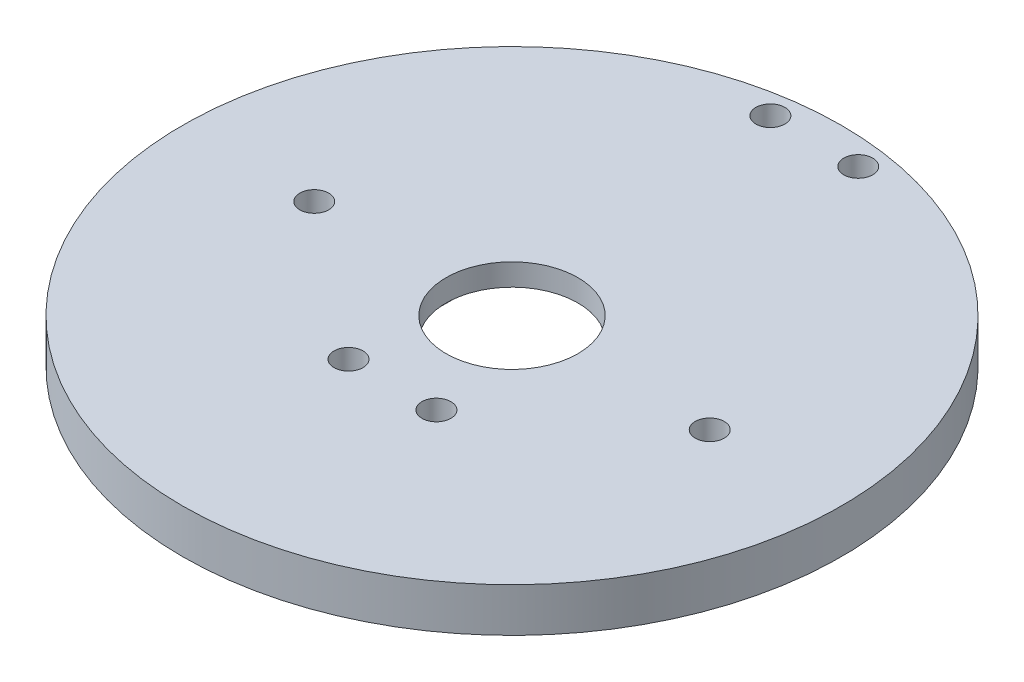
ISO-10303-21;
HEADER;
FILE_DESCRIPTION(('STEP AP214'),'2;1');
FILE_NAME('part.step','',(''),(''),'','','');
FILE_SCHEMA(('AUTOMOTIVE_DESIGN { 1 0 10303 214 1 1 1 1 }'));
ENDSEC;
DATA;
#1=APPLICATION_CONTEXT('core data for automotive mechanical design processes');
#2=APPLICATION_PROTOCOL_DEFINITION('international standard','automotive_design',2000,#1);
#3=PRODUCT_CONTEXT('',#1,'mechanical');
#4=PRODUCT('Part','Part','',(#3));
#5=PRODUCT_RELATED_PRODUCT_CATEGORY('part','',(#4));
#6=PRODUCT_DEFINITION_FORMATION('','',#4);
#7=PRODUCT_DEFINITION_CONTEXT('part definition',#1,'design');
#8=PRODUCT_DEFINITION('design','',#6,#7);
#9=PRODUCT_DEFINITION_SHAPE('','',#8);
#10=(LENGTH_UNIT() NAMED_UNIT(*) SI_UNIT(.MILLI.,.METRE.));
#11=(NAMED_UNIT(*) PLANE_ANGLE_UNIT() SI_UNIT($,.RADIAN.));
#12=(NAMED_UNIT(*) SI_UNIT($,.STERADIAN.) SOLID_ANGLE_UNIT());
#13=UNCERTAINTY_MEASURE_WITH_UNIT(LENGTH_MEASURE(1.E-05),#10,'distance_accuracy_value','');
#14=(GEOMETRIC_REPRESENTATION_CONTEXT(3) GLOBAL_UNCERTAINTY_ASSIGNED_CONTEXT((#13)) GLOBAL_UNIT_ASSIGNED_CONTEXT((#10,
#11,#12)) REPRESENTATION_CONTEXT('',''));
#15=CARTESIAN_POINT('',(0.,0.,0.));
#16=DIRECTION('',(0.,0.,1.));
#17=DIRECTION('',(1.,0.,0.));
#18=AXIS2_PLACEMENT_3D('',#15,#16,#17);
#19=CARTESIAN_POINT('',(0.,-5.,0.));
#20=DIRECTION('',(0.,1.,0.));
#21=DIRECTION('',(0.,0.,1.));
#22=AXIS2_PLACEMENT_3D('',#19,#20,#21);
#23=CYLINDRICAL_SURFACE('',#22,37.5);
#24=CARTESIAN_POINT('',(0.,-5.,0.));
#25=DIRECTION('',(0.,1.,0.));
#26=DIRECTION('',(0.,0.,1.));
#27=AXIS2_PLACEMENT_3D('',#24,#25,#26);
#28=CIRCLE('',#27,37.5);
#29=CARTESIAN_POINT('',(0.,-5.,37.5));
#30=VERTEX_POINT('',#29);
#31=EDGE_CURVE('E11',#30,#30,#28,.T.);
#32=ORIENTED_EDGE('',*,*,#31,.T.);
#33=EDGE_LOOP('',(#32));
#34=FACE_BOUND('',#33,.T.);
#35=CARTESIAN_POINT('',(0.,0.,0.));
#36=DIRECTION('',(0.,1.,0.));
#37=DIRECTION('',(0.,0.,1.));
#38=AXIS2_PLACEMENT_3D('',#35,#36,#37);
#39=CIRCLE('',#38,37.5);
#40=CARTESIAN_POINT('',(0.,0.,37.5));
#41=VERTEX_POINT('',#40);
#42=EDGE_CURVE('E33',#41,#41,#39,.T.);
#43=ORIENTED_EDGE('',*,*,#42,.F.);
#44=EDGE_LOOP('',(#43));
#45=FACE_BOUND('',#44,.T.);
#46=ADVANCED_FACE('F30',(#34,#45),#23,.T.);
#47=CARTESIAN_POINT('',(0.,-5.,0.));
#48=DIRECTION('',(0.,1.,0.));
#49=DIRECTION('',(0.,0.,1.));
#50=AXIS2_PLACEMENT_3D('',#47,#48,#49);
#51=PLANE('',#50);
#52=CARTESIAN_POINT('',(-4.99999999999991,-5.,-34.4));
#53=DIRECTION('',(0.,-1.,0.));
#54=DIRECTION('',(0.,0.,-1.));
#55=AXIS2_PLACEMENT_3D('',#52,#53,#54);
#56=CIRCLE('',#55,1.64999999999999);
#57=CARTESIAN_POINT('',(-4.99999999999991,-5.,-36.05));
#58=VERTEX_POINT('',#57);
#59=EDGE_CURVE('E367',#58,#58,#56,.T.);
#60=ORIENTED_EDGE('',*,*,#59,.F.);
#61=EDGE_LOOP('',(#60));
#62=FACE_BOUND('',#61,.T.);
#63=CARTESIAN_POINT('',(5.00000000000012,-5.,-34.4));
#64=DIRECTION('',(0.,-1.,0.));
#65=DIRECTION('',(0.,0.,-1.));
#66=AXIS2_PLACEMENT_3D('',#63,#64,#65);
#67=CIRCLE('',#66,1.64999999999999);
#68=CARTESIAN_POINT('',(5.00000000000012,-5.,-36.05));
#69=VERTEX_POINT('',#68);
#70=EDGE_CURVE('E369',#69,#69,#67,.T.);
#71=ORIENTED_EDGE('',*,*,#70,.F.);
#72=EDGE_LOOP('',(#71));
#73=FACE_BOUND('',#72,.T.);
#74=CARTESIAN_POINT('',(-5.00000000000005,-5.,13.6));
#75=DIRECTION('',(0.,-1.,0.));
#76=DIRECTION('',(0.,0.,-1.));
#77=AXIS2_PLACEMENT_3D('',#74,#75,#76);
#78=CIRCLE('',#77,1.64999999999999);
#79=CARTESIAN_POINT('',(-5.00000000000005,-5.,11.95));
#80=VERTEX_POINT('',#79);
#81=EDGE_CURVE('E377',#80,#80,#78,.T.);
#82=ORIENTED_EDGE('',*,*,#81,.F.);
#83=EDGE_LOOP('',(#82));
#84=FACE_BOUND('',#83,.T.);
#85=CARTESIAN_POINT('',(4.99999999999996,-5.,13.6));
#86=DIRECTION('',(0.,-1.,0.));
#87=DIRECTION('',(0.,0.,-1.));
#88=AXIS2_PLACEMENT_3D('',#85,#86,#87);
#89=CIRCLE('',#88,1.64999999999999);
#90=CARTESIAN_POINT('',(4.99999999999996,-5.,11.95));
#91=VERTEX_POINT('',#90);
#92=EDGE_CURVE('E383',#91,#91,#89,.T.);
#93=ORIENTED_EDGE('',*,*,#92,.F.);
#94=EDGE_LOOP('',(#93));
#95=FACE_BOUND('',#94,.T.);
#96=CARTESIAN_POINT('',(22.5,-5.,0.));
#97=DIRECTION('',(0.,-1.,0.));
#98=DIRECTION('',(0.,0.,-1.));
#99=AXIS2_PLACEMENT_3D('',#96,#97,#98);
#100=CIRCLE('',#99,1.64999999999999);
#101=CARTESIAN_POINT('',(22.5,-5.,-1.64999999999999));
#102=VERTEX_POINT('',#101);
#103=EDGE_CURVE('E389',#102,#102,#100,.T.);
#104=ORIENTED_EDGE('',*,*,#103,.F.);
#105=EDGE_LOOP('',(#104));
#106=FACE_BOUND('',#105,.T.);
#107=CARTESIAN_POINT('',(-22.5,-5.,0.));
#108=DIRECTION('',(0.,-1.,0.));
#109=DIRECTION('',(0.,0.,-1.));
#110=AXIS2_PLACEMENT_3D('',#107,#108,#109);
#111=CIRCLE('',#110,1.64999999999999);
#112=CARTESIAN_POINT('',(-22.5,-5.,-1.64999999999999));
#113=VERTEX_POINT('',#112);
#114=EDGE_CURVE('E395',#113,#113,#111,.T.);
#115=ORIENTED_EDGE('',*,*,#114,.F.);
#116=EDGE_LOOP('',(#115));
#117=FACE_BOUND('',#116,.T.);
#118=DIRECTION('',(0.,0.,1.));
#119=VECTOR('',#118,1.);
#120=CARTESIAN_POINT('',(9.94999999999997,-5.,0.999999999999964));
#121=LINE('',#120,#119);
#122=CARTESIAN_POINT('',(9.94999999999997,-5.,-21.8));
#123=VERTEX_POINT('',#122);
#124=CARTESIAN_POINT('',(9.94999999999997,-5.,0.999999999999964));
#125=VERTEX_POINT('',#124);
#126=EDGE_CURVE('E130',#123,#125,#121,.T.);
#127=ORIENTED_EDGE('',*,*,#126,.F.);
#128=CARTESIAN_POINT('',(0.949999999999968,-5.,-21.8));
#129=DIRECTION('',(0.,-1.,0.));
#130=DIRECTION('',(0.,0.,-1.));
#131=AXIS2_PLACEMENT_3D('',#128,#129,#130);
#132=CIRCLE('',#131,9.);
#133=CARTESIAN_POINT('',(0.94999999999997,-5.,-30.8));
#134=VERTEX_POINT('',#133);
#135=EDGE_CURVE('E44',#134,#123,#132,.T.);
#136=ORIENTED_EDGE('',*,*,#135,.F.);
#137=DIRECTION('',(1.,0.,0.));
#138=VECTOR('',#137,1.);
#139=CARTESIAN_POINT('',(-0.949999999999907,-5.,-30.8));
#140=LINE('',#139,#138);
#141=CARTESIAN_POINT('',(-0.949999999999907,-5.,-30.8));
#142=VERTEX_POINT('',#141);
#143=EDGE_CURVE('E146',#142,#134,#140,.T.);
#144=ORIENTED_EDGE('',*,*,#143,.F.);
#145=CARTESIAN_POINT('',(-0.949999999999909,-5.,-21.8));
#146=DIRECTION('',(0.,-1.,0.));
#147=DIRECTION('',(0.,0.,-1.));
#148=AXIS2_PLACEMENT_3D('',#145,#146,#147);
#149=CIRCLE('',#148,9.);
#150=CARTESIAN_POINT('',(-9.94999999999991,-5.,-21.8));
#151=VERTEX_POINT('',#150);
#152=EDGE_CURVE('E144',#151,#142,#149,.T.);
#153=ORIENTED_EDGE('',*,*,#152,.F.);
#154=DIRECTION('',(0.,0.,-1.));
#155=VECTOR('',#154,1.);
#156=CARTESIAN_POINT('',(-9.94999999999991,-5.,0.999999999999964));
#157=LINE('',#156,#155);
#158=CARTESIAN_POINT('',(-9.94999999999991,-5.,0.999999999999964));
#159=VERTEX_POINT('',#158);
#160=EDGE_CURVE('E104',#159,#151,#157,.T.);
#161=ORIENTED_EDGE('',*,*,#160,.F.);
#162=CARTESIAN_POINT('',(-0.949999999999913,-5.,0.999999999999964));
#163=DIRECTION('',(0.,-1.,0.));
#164=DIRECTION('',(0.,0.,-1.));
#165=AXIS2_PLACEMENT_3D('',#162,#163,#164);
#166=CIRCLE('',#165,9.);
#167=CARTESIAN_POINT('',(-0.949999999999912,-5.,9.99999999999996));
#168=VERTEX_POINT('',#167);
#169=EDGE_CURVE('E140',#168,#159,#166,.T.);
#170=ORIENTED_EDGE('',*,*,#169,.F.);
#171=DIRECTION('',(-1.,0.,0.));
#172=VECTOR('',#171,1.);
#173=CARTESIAN_POINT('',(-0.949999999999913,-5.,9.99999999999996));
#174=LINE('',#173,#172);
#175=CARTESIAN_POINT('',(0.949999999999968,-5.,9.99999999999996));
#176=VERTEX_POINT('',#175);
#177=EDGE_CURVE('E137',#176,#168,#174,.T.);
#178=ORIENTED_EDGE('',*,*,#177,.F.);
#179=CARTESIAN_POINT('',(0.949999999999968,-5.,0.999999999999964));
#180=DIRECTION('',(0.,-1.,0.));
#181=DIRECTION('',(0.,0.,-1.));
#182=AXIS2_PLACEMENT_3D('',#179,#180,#181);
#183=CIRCLE('',#182,9.);
#184=EDGE_CURVE('E134',#125,#176,#183,.T.);
#185=ORIENTED_EDGE('',*,*,#184,.F.);
#186=EDGE_LOOP('',(#127,#136,#144,#153,#161,#170,#178,#185));
#187=FACE_BOUND('',#186,.T.);
#188=ORIENTED_EDGE('',*,*,#31,.F.);
#189=EDGE_LOOP('',(#188));
#190=FACE_BOUND('',#189,.T.);
#191=ADVANCED_FACE('F165',(#62,#73,#84,#95,#106,#117,#187,#190),#51,.F.);
#192=CARTESIAN_POINT('',(0.,0.,0.));
#193=DIRECTION('',(0.,1.,0.));
#194=DIRECTION('',(0.,0.,1.));
#195=AXIS2_PLACEMENT_3D('',#192,#193,#194);
#196=PLANE('',#195);
#197=CARTESIAN_POINT('',(-4.99999999999991,0.,-34.4));
#198=DIRECTION('',(0.,-1.,0.));
#199=DIRECTION('',(0.,0.,-1.));
#200=AXIS2_PLACEMENT_3D('',#197,#198,#199);
#201=CIRCLE('',#200,1.65);
#202=CARTESIAN_POINT('',(-4.99999999999991,0.,-36.05));
#203=VERTEX_POINT('',#202);
#204=EDGE_CURVE('E364',#203,#203,#201,.T.);
#205=ORIENTED_EDGE('',*,*,#204,.T.);
#206=EDGE_LOOP('',(#205));
#207=FACE_BOUND('',#206,.T.);
#208=CARTESIAN_POINT('',(5.00000000000012,0.,-34.4));
#209=DIRECTION('',(0.,-1.,0.));
#210=DIRECTION('',(0.,0.,-1.));
#211=AXIS2_PLACEMENT_3D('',#208,#209,#210);
#212=CIRCLE('',#211,1.65);
#213=CARTESIAN_POINT('',(5.00000000000012,0.,-36.05));
#214=VERTEX_POINT('',#213);
#215=EDGE_CURVE('E374',#214,#214,#212,.T.);
#216=ORIENTED_EDGE('',*,*,#215,.T.);
#217=EDGE_LOOP('',(#216));
#218=FACE_BOUND('',#217,.T.);
#219=CARTESIAN_POINT('',(-5.00000000000005,0.,13.6));
#220=DIRECTION('',(0.,-1.,0.));
#221=DIRECTION('',(0.,0.,-1.));
#222=AXIS2_PLACEMENT_3D('',#219,#220,#221);
#223=CIRCLE('',#222,1.65);
#224=CARTESIAN_POINT('',(-5.00000000000005,0.,11.95));
#225=VERTEX_POINT('',#224);
#226=EDGE_CURVE('E380',#225,#225,#223,.T.);
#227=ORIENTED_EDGE('',*,*,#226,.T.);
#228=EDGE_LOOP('',(#227));
#229=FACE_BOUND('',#228,.T.);
#230=CARTESIAN_POINT('',(4.99999999999996,0.,13.6));
#231=DIRECTION('',(0.,-1.,0.));
#232=DIRECTION('',(0.,0.,-1.));
#233=AXIS2_PLACEMENT_3D('',#230,#231,#232);
#234=CIRCLE('',#233,1.65);
#235=CARTESIAN_POINT('',(4.99999999999996,0.,11.95));
#236=VERTEX_POINT('',#235);
#237=EDGE_CURVE('E386',#236,#236,#234,.T.);
#238=ORIENTED_EDGE('',*,*,#237,.T.);
#239=EDGE_LOOP('',(#238));
#240=FACE_BOUND('',#239,.T.);
#241=CARTESIAN_POINT('',(22.5,0.,0.));
#242=DIRECTION('',(0.,-1.,0.));
#243=DIRECTION('',(0.,0.,-1.));
#244=AXIS2_PLACEMENT_3D('',#241,#242,#243);
#245=CIRCLE('',#244,1.65);
#246=CARTESIAN_POINT('',(22.5,0.,-1.65));
#247=VERTEX_POINT('',#246);
#248=EDGE_CURVE('E392',#247,#247,#245,.T.);
#249=ORIENTED_EDGE('',*,*,#248,.T.);
#250=EDGE_LOOP('',(#249));
#251=FACE_BOUND('',#250,.T.);
#252=CARTESIAN_POINT('',(-22.5,0.,0.));
#253=DIRECTION('',(0.,-1.,0.));
#254=DIRECTION('',(0.,0.,-1.));
#255=AXIS2_PLACEMENT_3D('',#252,#253,#254);
#256=CIRCLE('',#255,1.65);
#257=CARTESIAN_POINT('',(-22.5,0.,-1.65));
#258=VERTEX_POINT('',#257);
#259=EDGE_CURVE('E398',#258,#258,#256,.T.);
#260=ORIENTED_EDGE('',*,*,#259,.T.);
#261=EDGE_LOOP('',(#260));
#262=FACE_BOUND('',#261,.T.);
#263=CARTESIAN_POINT('',(0.,0.,0.));
#264=DIRECTION('',(0.,-1.,0.));
#265=DIRECTION('',(1.,0.,0.));
#266=AXIS2_PLACEMENT_3D('',#263,#264,#265);
#267=CIRCLE('',#266,7.50000000000001);
#268=CARTESIAN_POINT('',(7.50000000000001,0.,0.));
#269=VERTEX_POINT('',#268);
#270=EDGE_CURVE('E131',#269,#269,#267,.T.);
#271=ORIENTED_EDGE('',*,*,#270,.T.);
#272=EDGE_LOOP('',(#271));
#273=FACE_BOUND('',#272,.T.);
#274=ORIENTED_EDGE('',*,*,#42,.T.);
#275=EDGE_LOOP('',(#274));
#276=FACE_BOUND('',#275,.T.);
#277=ADVANCED_FACE('F193',(#207,#218,#229,#240,#251,#262,#273,#276),#196,.T.);
#278=CARTESIAN_POINT('',(0.949999999999968,-2.5,-21.8));
#279=DIRECTION('',(0.,-1.,0.));
#280=DIRECTION('',(0.,0.,-1.));
#281=AXIS2_PLACEMENT_3D('',#278,#279,#280);
#282=CYLINDRICAL_SURFACE('',#281,9.);
#283=ORIENTED_EDGE('',*,*,#135,.T.);
#284=DIRECTION('',(0.,-1.,0.));
#285=VECTOR('',#284,1.);
#286=CARTESIAN_POINT('',(9.94999999999997,-2.5,-21.8));
#287=LINE('',#286,#285);
#288=CARTESIAN_POINT('',(9.94999999999997,-2.5,-21.8));
#289=VERTEX_POINT('',#288);
#290=EDGE_CURVE('E80',#289,#123,#287,.T.);
#291=ORIENTED_EDGE('',*,*,#290,.F.);
#292=CARTESIAN_POINT('',(0.949999999999968,-2.5,-21.8));
#293=DIRECTION('',(0.,-1.,0.));
#294=DIRECTION('',(0.,0.,-1.));
#295=AXIS2_PLACEMENT_3D('',#292,#293,#294);
#296=CIRCLE('',#295,9.);
#297=CARTESIAN_POINT('',(0.94999999999997,-2.5,-30.8));
#298=VERTEX_POINT('',#297);
#299=EDGE_CURVE('E148',#298,#289,#296,.T.);
#300=ORIENTED_EDGE('',*,*,#299,.F.);
#301=DIRECTION('',(0.,-1.,0.));
#302=VECTOR('',#301,1.);
#303=CARTESIAN_POINT('',(0.94999999999997,-2.5,-30.8));
#304=LINE('',#303,#302);
#305=EDGE_CURVE('E52',#298,#134,#304,.T.);
#306=ORIENTED_EDGE('',*,*,#305,.T.);
#307=EDGE_LOOP('',(#283,#291,#300,#306));
#308=FACE_BOUND('',#307,.T.);
#309=ADVANCED_FACE('F186',(#308),#282,.F.);
#310=CARTESIAN_POINT('',(-0.949999999999907,-2.5,-30.8));
#311=DIRECTION('',(0.,0.,-1.));
#312=DIRECTION('',(-1.,0.,0.));
#313=AXIS2_PLACEMENT_3D('',#310,#311,#312);
#314=PLANE('',#313);
#315=ORIENTED_EDGE('',*,*,#143,.T.);
#316=ORIENTED_EDGE('',*,*,#305,.F.);
#317=DIRECTION('',(1.,0.,0.));
#318=VECTOR('',#317,1.);
#319=CARTESIAN_POINT('',(-0.949999999999907,-2.5,-30.8));
#320=LINE('',#319,#318);
#321=CARTESIAN_POINT('',(-0.949999999999907,-2.5,-30.8));
#322=VERTEX_POINT('',#321);
#323=EDGE_CURVE('E116',#322,#298,#320,.T.);
#324=ORIENTED_EDGE('',*,*,#323,.F.);
#325=DIRECTION('',(0.,-1.,0.));
#326=VECTOR('',#325,1.);
#327=CARTESIAN_POINT('',(-0.949999999999907,-2.5,-30.8));
#328=LINE('',#327,#326);
#329=EDGE_CURVE('E108',#322,#142,#328,.T.);
#330=ORIENTED_EDGE('',*,*,#329,.T.);
#331=EDGE_LOOP('',(#315,#316,#324,#330));
#332=FACE_BOUND('',#331,.T.);
#333=ADVANCED_FACE('F184',(#332),#314,.F.);
#334=CARTESIAN_POINT('',(-0.949999999999909,-2.5,-21.8));
#335=DIRECTION('',(0.,-1.,0.));
#336=DIRECTION('',(0.,0.,-1.));
#337=AXIS2_PLACEMENT_3D('',#334,#335,#336);
#338=CYLINDRICAL_SURFACE('',#337,9.);
#339=ORIENTED_EDGE('',*,*,#152,.T.);
#340=ORIENTED_EDGE('',*,*,#329,.F.);
#341=CARTESIAN_POINT('',(-0.949999999999909,-2.5,-21.8));
#342=DIRECTION('',(0.,-1.,0.));
#343=DIRECTION('',(0.,0.,-1.));
#344=AXIS2_PLACEMENT_3D('',#341,#342,#343);
#345=CIRCLE('',#344,9.);
#346=CARTESIAN_POINT('',(-9.94999999999991,-2.5,-21.8));
#347=VERTEX_POINT('',#346);
#348=EDGE_CURVE('E112',#347,#322,#345,.T.);
#349=ORIENTED_EDGE('',*,*,#348,.F.);
#350=DIRECTION('',(0.,-1.,0.));
#351=VECTOR('',#350,1.);
#352=CARTESIAN_POINT('',(-9.94999999999991,-2.5,-21.8));
#353=LINE('',#352,#351);
#354=EDGE_CURVE('E97',#347,#151,#353,.T.);
#355=ORIENTED_EDGE('',*,*,#354,.T.);
#356=EDGE_LOOP('',(#339,#340,#349,#355));
#357=FACE_BOUND('',#356,.T.);
#358=ADVANCED_FACE('F113',(#357),#338,.F.);
#359=CARTESIAN_POINT('',(-9.94999999999991,-2.5,0.999999999999964));
#360=DIRECTION('',(-1.,0.,0.));
#361=DIRECTION('',(0.,0.,1.));
#362=AXIS2_PLACEMENT_3D('',#359,#360,#361);
#363=PLANE('',#362);
#364=ORIENTED_EDGE('',*,*,#160,.T.);
#365=ORIENTED_EDGE('',*,*,#354,.F.);
#366=DIRECTION('',(0.,0.,-1.));
#367=VECTOR('',#366,1.);
#368=CARTESIAN_POINT('',(-9.94999999999991,-2.5,0.999999999999964));
#369=LINE('',#368,#367);
#370=CARTESIAN_POINT('',(-9.94999999999991,-2.5,0.999999999999964));
#371=VERTEX_POINT('',#370);
#372=EDGE_CURVE('E101',#371,#347,#369,.T.);
#373=ORIENTED_EDGE('',*,*,#372,.F.);
#374=DIRECTION('',(0.,-1.,0.));
#375=VECTOR('',#374,1.);
#376=CARTESIAN_POINT('',(-9.94999999999991,-2.5,0.999999999999964));
#377=LINE('',#376,#375);
#378=EDGE_CURVE('E109',#371,#159,#377,.T.);
#379=ORIENTED_EDGE('',*,*,#378,.T.);
#380=EDGE_LOOP('',(#364,#365,#373,#379));
#381=FACE_BOUND('',#380,.T.);
#382=ADVANCED_FACE('F99',(#381),#363,.F.);
#383=CARTESIAN_POINT('',(-0.949999999999913,-2.5,0.999999999999964));
#384=DIRECTION('',(0.,-1.,0.));
#385=DIRECTION('',(0.,0.,-1.));
#386=AXIS2_PLACEMENT_3D('',#383,#384,#385);
#387=CYLINDRICAL_SURFACE('',#386,9.);
#388=ORIENTED_EDGE('',*,*,#169,.T.);
#389=ORIENTED_EDGE('',*,*,#378,.F.);
#390=CARTESIAN_POINT('',(-0.949999999999913,-2.5,0.999999999999964));
#391=DIRECTION('',(0.,-1.,0.));
#392=DIRECTION('',(0.,0.,-1.));
#393=AXIS2_PLACEMENT_3D('',#390,#391,#392);
#394=CIRCLE('',#393,9.);
#395=CARTESIAN_POINT('',(-0.949999999999912,-2.5,9.99999999999996));
#396=VERTEX_POINT('',#395);
#397=EDGE_CURVE('E122',#396,#371,#394,.T.);
#398=ORIENTED_EDGE('',*,*,#397,.F.);
#399=DIRECTION('',(0.,-1.,0.));
#400=VECTOR('',#399,1.);
#401=CARTESIAN_POINT('',(-0.949999999999912,-2.5,9.99999999999996));
#402=LINE('',#401,#400);
#403=EDGE_CURVE('E152',#396,#168,#402,.T.);
#404=ORIENTED_EDGE('',*,*,#403,.T.);
#405=EDGE_LOOP('',(#388,#389,#398,#404));
#406=FACE_BOUND('',#405,.T.);
#407=ADVANCED_FACE('F183',(#406),#387,.F.);
#408=CARTESIAN_POINT('',(-0.949999999999913,-2.5,9.99999999999996));
#409=DIRECTION('',(0.,0.,1.));
#410=DIRECTION('',(1.,0.,0.));
#411=AXIS2_PLACEMENT_3D('',#408,#409,#410);
#412=PLANE('',#411);
#413=ORIENTED_EDGE('',*,*,#177,.T.);
#414=ORIENTED_EDGE('',*,*,#403,.F.);
#415=DIRECTION('',(-1.,0.,0.));
#416=VECTOR('',#415,1.);
#417=CARTESIAN_POINT('',(-0.949999999999913,-2.5,9.99999999999996));
#418=LINE('',#417,#416);
#419=CARTESIAN_POINT('',(0.949999999999968,-2.5,9.99999999999996));
#420=VERTEX_POINT('',#419);
#421=EDGE_CURVE('E124',#420,#396,#418,.T.);
#422=ORIENTED_EDGE('',*,*,#421,.F.);
#423=DIRECTION('',(0.,-1.,0.));
#424=VECTOR('',#423,1.);
#425=CARTESIAN_POINT('',(0.949999999999968,-2.5,9.99999999999996));
#426=LINE('',#425,#424);
#427=EDGE_CURVE('E154',#420,#176,#426,.T.);
#428=ORIENTED_EDGE('',*,*,#427,.T.);
#429=EDGE_LOOP('',(#413,#414,#422,#428));
#430=FACE_BOUND('',#429,.T.);
#431=ADVANCED_FACE('F181',(#430),#412,.F.);
#432=CARTESIAN_POINT('',(0.949999999999968,-2.5,0.999999999999964));
#433=DIRECTION('',(0.,-1.,0.));
#434=DIRECTION('',(0.,0.,-1.));
#435=AXIS2_PLACEMENT_3D('',#432,#433,#434);
#436=CYLINDRICAL_SURFACE('',#435,9.);
#437=ORIENTED_EDGE('',*,*,#184,.T.);
#438=ORIENTED_EDGE('',*,*,#427,.F.);
#439=CARTESIAN_POINT('',(0.949999999999968,-2.5,0.999999999999964));
#440=DIRECTION('',(0.,-1.,0.));
#441=DIRECTION('',(0.,0.,-1.));
#442=AXIS2_PLACEMENT_3D('',#439,#440,#441);
#443=CIRCLE('',#442,9.);
#444=CARTESIAN_POINT('',(9.94999999999997,-2.5,0.999999999999964));
#445=VERTEX_POINT('',#444);
#446=EDGE_CURVE('E175',#445,#420,#443,.T.);
#447=ORIENTED_EDGE('',*,*,#446,.F.);
#448=DIRECTION('',(0.,-1.,0.));
#449=VECTOR('',#448,1.);
#450=CARTESIAN_POINT('',(9.94999999999997,-2.5,0.999999999999964));
#451=LINE('',#450,#449);
#452=EDGE_CURVE('E156',#445,#125,#451,.T.);
#453=ORIENTED_EDGE('',*,*,#452,.T.);
#454=EDGE_LOOP('',(#437,#438,#447,#453));
#455=FACE_BOUND('',#454,.T.);
#456=ADVANCED_FACE('F171',(#455),#436,.F.);
#457=CARTESIAN_POINT('',(9.94999999999997,-2.5,0.999999999999964));
#458=DIRECTION('',(1.,0.,0.));
#459=DIRECTION('',(0.,0.,-1.));
#460=AXIS2_PLACEMENT_3D('',#457,#458,#459);
#461=PLANE('',#460);
#462=ORIENTED_EDGE('',*,*,#126,.T.);
#463=ORIENTED_EDGE('',*,*,#452,.F.);
#464=DIRECTION('',(0.,0.,1.));
#465=VECTOR('',#464,1.);
#466=CARTESIAN_POINT('',(9.94999999999997,-2.5,0.999999999999964));
#467=LINE('',#466,#465);
#468=EDGE_CURVE('E163',#289,#445,#467,.T.);
#469=ORIENTED_EDGE('',*,*,#468,.F.);
#470=ORIENTED_EDGE('',*,*,#290,.T.);
#471=EDGE_LOOP('',(#462,#463,#469,#470));
#472=FACE_BOUND('',#471,.T.);
#473=ADVANCED_FACE('F160',(#472),#461,.F.);
#474=CARTESIAN_POINT('',(0.949999999999968,-2.5,-21.8));
#475=DIRECTION('',(0.,-1.,0.));
#476=DIRECTION('',(0.,0.,-1.));
#477=AXIS2_PLACEMENT_3D('',#474,#475,#476);
#478=PLANE('',#477);
#479=CARTESIAN_POINT('',(0.,-2.5,0.));
#480=DIRECTION('',(0.,-1.,0.));
#481=DIRECTION('',(1.,0.,0.));
#482=AXIS2_PLACEMENT_3D('',#479,#480,#481);
#483=CIRCLE('',#482,7.50000000000001);
#484=CARTESIAN_POINT('',(7.50000000000001,-2.5,0.));
#485=VERTEX_POINT('',#484);
#486=EDGE_CURVE('E401',#485,#485,#483,.T.);
#487=ORIENTED_EDGE('',*,*,#486,.F.);
#488=EDGE_LOOP('',(#487));
#489=FACE_BOUND('',#488,.T.);
#490=ORIENTED_EDGE('',*,*,#299,.T.);
#491=ORIENTED_EDGE('',*,*,#468,.T.);
#492=ORIENTED_EDGE('',*,*,#446,.T.);
#493=ORIENTED_EDGE('',*,*,#421,.T.);
#494=ORIENTED_EDGE('',*,*,#397,.T.);
#495=ORIENTED_EDGE('',*,*,#372,.T.);
#496=ORIENTED_EDGE('',*,*,#348,.T.);
#497=ORIENTED_EDGE('',*,*,#323,.T.);
#498=EDGE_LOOP('',(#490,#491,#492,#493,#494,#495,#496,#497));
#499=FACE_BOUND('',#498,.T.);
#500=ADVANCED_FACE('F119',(#489,#499),#478,.T.);
#501=CARTESIAN_POINT('',(0.,0.,0.));
#502=DIRECTION('',(0.,-1.,0.));
#503=DIRECTION('',(1.,0.,0.));
#504=AXIS2_PLACEMENT_3D('',#501,#502,#503);
#505=CYLINDRICAL_SURFACE('',#504,7.50000000000001);
#506=ORIENTED_EDGE('',*,*,#270,.F.);
#507=EDGE_LOOP('',(#506));
#508=FACE_BOUND('',#507,.T.);
#509=ORIENTED_EDGE('',*,*,#486,.T.);
#510=EDGE_LOOP('',(#509));
#511=FACE_BOUND('',#510,.T.);
#512=ADVANCED_FACE('F250',(#508,#511),#505,.F.);
#513=CARTESIAN_POINT('',(-22.5,-5.,0.));
#514=DIRECTION('',(0.,-1.,0.));
#515=DIRECTION('',(0.,0.,-1.));
#516=AXIS2_PLACEMENT_3D('',#513,#514,#515);
#517=CYLINDRICAL_SURFACE('',#516,1.64999999999999);
#518=ORIENTED_EDGE('',*,*,#259,.F.);
#519=EDGE_LOOP('',(#518));
#520=FACE_BOUND('',#519,.T.);
#521=ORIENTED_EDGE('',*,*,#114,.T.);
#522=EDGE_LOOP('',(#521));
#523=FACE_BOUND('',#522,.T.);
#524=ADVANCED_FACE('F257',(#520,#523),#517,.F.);
#525=CARTESIAN_POINT('',(22.5,-5.,0.));
#526=DIRECTION('',(0.,-1.,0.));
#527=DIRECTION('',(0.,0.,-1.));
#528=AXIS2_PLACEMENT_3D('',#525,#526,#527);
#529=CYLINDRICAL_SURFACE('',#528,1.64999999999999);
#530=ORIENTED_EDGE('',*,*,#248,.F.);
#531=EDGE_LOOP('',(#530));
#532=FACE_BOUND('',#531,.T.);
#533=ORIENTED_EDGE('',*,*,#103,.T.);
#534=EDGE_LOOP('',(#533));
#535=FACE_BOUND('',#534,.T.);
#536=ADVANCED_FACE('F266',(#532,#535),#529,.F.);
#537=CARTESIAN_POINT('',(4.99999999999996,-5.,13.6));
#538=DIRECTION('',(0.,-1.,0.));
#539=DIRECTION('',(0.,0.,-1.));
#540=AXIS2_PLACEMENT_3D('',#537,#538,#539);
#541=CYLINDRICAL_SURFACE('',#540,1.64999999999999);
#542=ORIENTED_EDGE('',*,*,#237,.F.);
#543=EDGE_LOOP('',(#542));
#544=FACE_BOUND('',#543,.T.);
#545=ORIENTED_EDGE('',*,*,#92,.T.);
#546=EDGE_LOOP('',(#545));
#547=FACE_BOUND('',#546,.T.);
#548=ADVANCED_FACE('F274',(#544,#547),#541,.F.);
#549=CARTESIAN_POINT('',(-5.00000000000005,-5.,13.6));
#550=DIRECTION('',(0.,-1.,0.));
#551=DIRECTION('',(0.,0.,-1.));
#552=AXIS2_PLACEMENT_3D('',#549,#550,#551);
#553=CYLINDRICAL_SURFACE('',#552,1.64999999999999);
#554=ORIENTED_EDGE('',*,*,#226,.F.);
#555=EDGE_LOOP('',(#554));
#556=FACE_BOUND('',#555,.T.);
#557=ORIENTED_EDGE('',*,*,#81,.T.);
#558=EDGE_LOOP('',(#557));
#559=FACE_BOUND('',#558,.T.);
#560=ADVANCED_FACE('F282',(#556,#559),#553,.F.);
#561=CARTESIAN_POINT('',(5.00000000000012,-5.,-34.4));
#562=DIRECTION('',(0.,-1.,0.));
#563=DIRECTION('',(0.,0.,-1.));
#564=AXIS2_PLACEMENT_3D('',#561,#562,#563);
#565=CYLINDRICAL_SURFACE('',#564,1.64999999999999);
#566=ORIENTED_EDGE('',*,*,#215,.F.);
#567=EDGE_LOOP('',(#566));
#568=FACE_BOUND('',#567,.T.);
#569=ORIENTED_EDGE('',*,*,#70,.T.);
#570=EDGE_LOOP('',(#569));
#571=FACE_BOUND('',#570,.T.);
#572=ADVANCED_FACE('F290',(#568,#571),#565,.F.);
#573=CARTESIAN_POINT('',(-4.99999999999991,-5.,-34.4));
#574=DIRECTION('',(0.,-1.,0.));
#575=DIRECTION('',(0.,0.,-1.));
#576=AXIS2_PLACEMENT_3D('',#573,#574,#575);
#577=CYLINDRICAL_SURFACE('',#576,1.64999999999999);
#578=ORIENTED_EDGE('',*,*,#204,.F.);
#579=EDGE_LOOP('',(#578));
#580=FACE_BOUND('',#579,.T.);
#581=ORIENTED_EDGE('',*,*,#59,.T.);
#582=EDGE_LOOP('',(#581));
#583=FACE_BOUND('',#582,.T.);
#584=ADVANCED_FACE('F298',(#580,#583),#577,.F.);
#585=CLOSED_SHELL('',(#46,#191,#277,#309,#333,#358,#382,#407,#431,#456,#473,#500,#512,#524,#536,
#548,#560,#572,#584));
#586=MANIFOLD_SOLID_BREP('B2',#585);
#587=ADVANCED_BREP_SHAPE_REPRESENTATION('',(#18,#586),#14);
#588=SHAPE_DEFINITION_REPRESENTATION(#9,#587);
ENDSEC;
END-ISO-10303-21;
